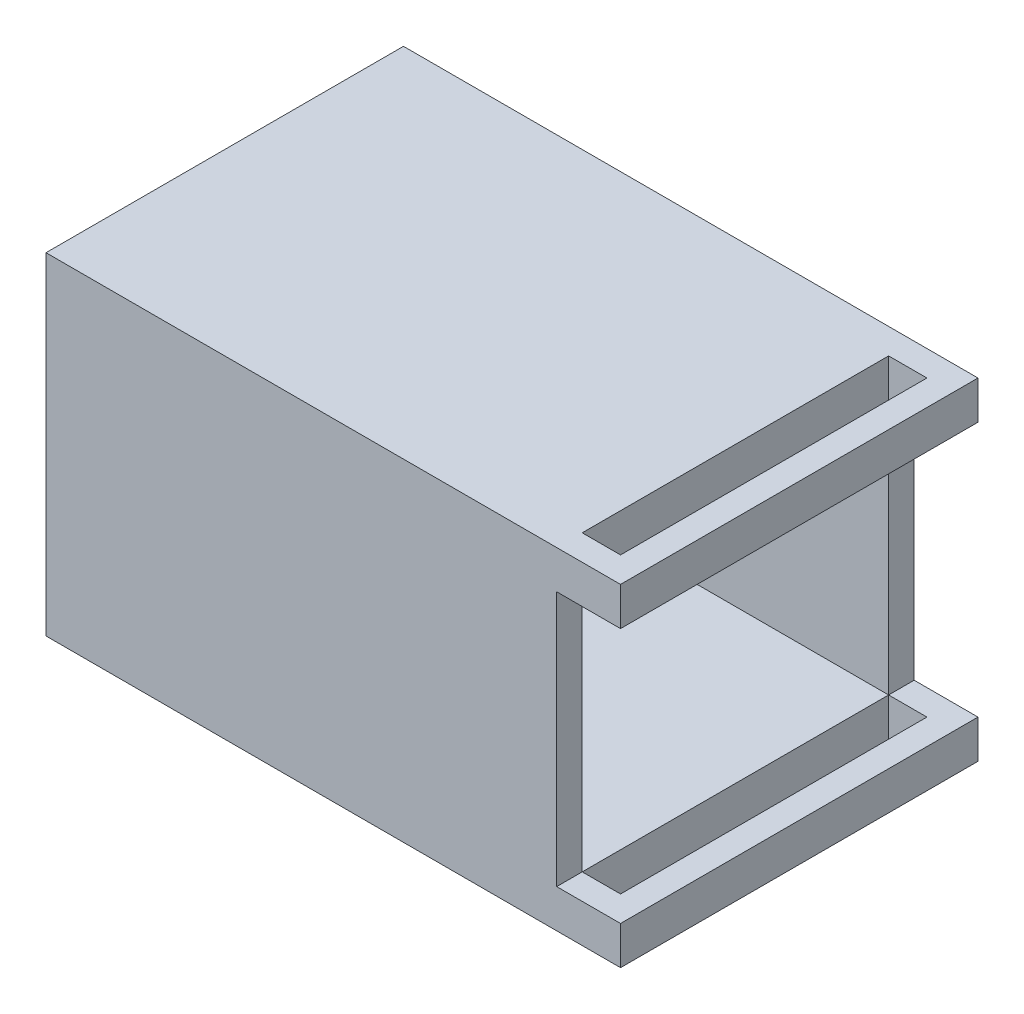
ISO-10303-21;
HEADER;
FILE_DESCRIPTION(('STEP AP214'),'2;1');
FILE_NAME('part.step','',(''),(''),'','','');
FILE_SCHEMA(('AUTOMOTIVE_DESIGN { 1 0 10303 214 1 1 1 1 }'));
ENDSEC;
DATA;
#1=APPLICATION_CONTEXT('core data for automotive mechanical design processes');
#2=APPLICATION_PROTOCOL_DEFINITION('international standard','automotive_design',2000,#1);
#3=PRODUCT_CONTEXT('',#1,'mechanical');
#4=PRODUCT('Part','Part','',(#3));
#5=PRODUCT_RELATED_PRODUCT_CATEGORY('part','',(#4));
#6=PRODUCT_DEFINITION_FORMATION('','',#4);
#7=PRODUCT_DEFINITION_CONTEXT('part definition',#1,'design');
#8=PRODUCT_DEFINITION('design','',#6,#7);
#9=PRODUCT_DEFINITION_SHAPE('','',#8);
#10=(LENGTH_UNIT() NAMED_UNIT(*) SI_UNIT(.MILLI.,.METRE.));
#11=(NAMED_UNIT(*) PLANE_ANGLE_UNIT() SI_UNIT($,.RADIAN.));
#12=(NAMED_UNIT(*) SI_UNIT($,.STERADIAN.) SOLID_ANGLE_UNIT());
#13=UNCERTAINTY_MEASURE_WITH_UNIT(LENGTH_MEASURE(1.E-05),#10,'distance_accuracy_value','');
#14=(GEOMETRIC_REPRESENTATION_CONTEXT(3) GLOBAL_UNCERTAINTY_ASSIGNED_CONTEXT((#13)) GLOBAL_UNIT_ASSIGNED_CONTEXT((#10,
#11,#12)) REPRESENTATION_CONTEXT('',''));
#15=CARTESIAN_POINT('',(0.,0.,0.));
#16=DIRECTION('',(0.,0.,1.));
#17=DIRECTION('',(1.,0.,0.));
#18=AXIS2_PLACEMENT_3D('',#15,#16,#17);
#19=CARTESIAN_POINT('',(0.,3.,0.));
#20=DIRECTION('',(0.,1.,0.));
#21=DIRECTION('',(0.,0.,1.));
#22=AXIS2_PLACEMENT_3D('',#19,#20,#21);
#23=PLANE('',#22);
#24=DIRECTION('',(0.,0.,-1.));
#25=VECTOR('',#24,1.);
#26=CARTESIAN_POINT('',(43.,3.,-2.));
#27=LINE('',#26,#25);
#28=CARTESIAN_POINT('',(43.,3.,-2.));
#29=VERTEX_POINT('',#28);
#30=CARTESIAN_POINT('',(43.,3.,-26.));
#31=VERTEX_POINT('',#30);
#32=EDGE_CURVE('E63',#29,#31,#27,.T.);
#33=ORIENTED_EDGE('',*,*,#32,.F.);
#34=DIRECTION('',(1.,0.,0.));
#35=VECTOR('',#34,1.);
#36=CARTESIAN_POINT('',(43.,3.,-2.));
#37=LINE('',#36,#35);
#38=CARTESIAN_POINT('',(40.,3.,-2.));
#39=VERTEX_POINT('',#38);
#40=EDGE_CURVE('E303',#39,#29,#37,.T.);
#41=ORIENTED_EDGE('',*,*,#40,.F.);
#42=DIRECTION('',(0.,0.,1.));
#43=VECTOR('',#42,1.);
#44=CARTESIAN_POINT('',(40.,3.,-2.));
#45=LINE('',#44,#43);
#46=CARTESIAN_POINT('',(40.,3.,0.));
#47=VERTEX_POINT('',#46);
#48=EDGE_CURVE('E528',#39,#47,#45,.T.);
#49=ORIENTED_EDGE('',*,*,#48,.T.);
#50=DIRECTION('',(1.,0.,0.));
#51=VECTOR('',#50,1.);
#52=CARTESIAN_POINT('',(0.,3.,0.));
#53=LINE('',#52,#51);
#54=CARTESIAN_POINT('',(45.,3.,0.));
#55=VERTEX_POINT('',#54);
#56=EDGE_CURVE('E569',#47,#55,#53,.T.);
#57=ORIENTED_EDGE('',*,*,#56,.T.);
#58=DIRECTION('',(0.,0.,-1.));
#59=VECTOR('',#58,1.);
#60=CARTESIAN_POINT('',(45.,3.,0.));
#61=LINE('',#60,#59);
#62=CARTESIAN_POINT('',(45.,3.,-28.));
#63=VERTEX_POINT('',#62);
#64=EDGE_CURVE('E564',#55,#63,#61,.T.);
#65=ORIENTED_EDGE('',*,*,#64,.T.);
#66=DIRECTION('',(1.,0.,0.));
#67=VECTOR('',#66,1.);
#68=CARTESIAN_POINT('',(0.,3.,-28.));
#69=LINE('',#68,#67);
#70=CARTESIAN_POINT('',(40.,3.,-28.));
#71=VERTEX_POINT('',#70);
#72=EDGE_CURVE('E561',#71,#63,#69,.T.);
#73=ORIENTED_EDGE('',*,*,#72,.F.);
#74=DIRECTION('',(0.,0.,-1.));
#75=VECTOR('',#74,1.);
#76=CARTESIAN_POINT('',(40.,3.,-26.));
#77=LINE('',#76,#75);
#78=CARTESIAN_POINT('',(40.,3.,-26.));
#79=VERTEX_POINT('',#78);
#80=EDGE_CURVE('E532',#79,#71,#77,.T.);
#81=ORIENTED_EDGE('',*,*,#80,.F.);
#82=DIRECTION('',(-1.,0.,0.));
#83=VECTOR('',#82,1.);
#84=CARTESIAN_POINT('',(43.,3.,-26.));
#85=LINE('',#84,#83);
#86=EDGE_CURVE('E316',#31,#79,#85,.T.);
#87=ORIENTED_EDGE('',*,*,#86,.F.);
#88=EDGE_LOOP('',(#33,#41,#49,#57,#65,#73,#81,#87));
#89=FACE_BOUND('',#88,.T.);
#90=ADVANCED_FACE('F47',(#89),#23,.T.);
#91=CARTESIAN_POINT('',(2.,25.,-26.));
#92=DIRECTION('',(1.,0.,0.));
#93=DIRECTION('',(0.,0.,-1.));
#94=AXIS2_PLACEMENT_3D('',#91,#92,#93);
#95=PLANE('',#94);
#96=CARTESIAN_POINT('',(2.,5.25,-17.47));
#97=DIRECTION('',(-1.,0.,0.));
#98=DIRECTION('',(0.,0.,1.));
#99=AXIS2_PLACEMENT_3D('',#96,#97,#98);
#100=CIRCLE('',#99,1.25);
#101=CARTESIAN_POINT('',(2.,5.25,-18.72));
#102=VERTEX_POINT('',#101);
#103=CARTESIAN_POINT('',(2.,4.,-17.47));
#104=VERTEX_POINT('',#103);
#105=EDGE_CURVE('E339',#102,#104,#100,.T.);
#106=ORIENTED_EDGE('',*,*,#105,.T.);
#107=DIRECTION('',(0.,0.,1.));
#108=VECTOR('',#107,1.);
#109=CARTESIAN_POINT('',(2.,4.,-17.47));
#110=LINE('',#109,#108);
#111=CARTESIAN_POINT('',(2.,4.,-10.53));
#112=VERTEX_POINT('',#111);
#113=EDGE_CURVE('E343',#104,#112,#110,.T.);
#114=ORIENTED_EDGE('',*,*,#113,.T.);
#115=CARTESIAN_POINT('',(2.,5.25,-10.53));
#116=DIRECTION('',(-1.,0.,0.));
#117=DIRECTION('',(0.,0.,1.));
#118=AXIS2_PLACEMENT_3D('',#115,#116,#117);
#119=CIRCLE('',#118,1.25);
#120=CARTESIAN_POINT('',(2.,5.25,-9.28));
#121=VERTEX_POINT('',#120);
#122=EDGE_CURVE('E348',#112,#121,#119,.T.);
#123=ORIENTED_EDGE('',*,*,#122,.T.);
#124=DIRECTION('',(0.,1.,0.));
#125=VECTOR('',#124,1.);
#126=CARTESIAN_POINT('',(2.,6.16,-9.28000000000001));
#127=LINE('',#126,#125);
#128=CARTESIAN_POINT('',(2.,6.16,-9.28));
#129=VERTEX_POINT('',#128);
#130=EDGE_CURVE('E352',#121,#129,#127,.T.);
#131=ORIENTED_EDGE('',*,*,#130,.T.);
#132=CARTESIAN_POINT('',(2.,6.16,-10.53));
#133=DIRECTION('',(-1.,0.,0.));
#134=DIRECTION('',(0.,0.,1.));
#135=AXIS2_PLACEMENT_3D('',#132,#133,#134);
#136=CIRCLE('',#135,1.25);
#137=CARTESIAN_POINT('',(2.,7.41,-10.53));
#138=VERTEX_POINT('',#137);
#139=EDGE_CURVE('E356',#129,#138,#136,.T.);
#140=ORIENTED_EDGE('',*,*,#139,.T.);
#141=DIRECTION('',(0.,0.,-1.));
#142=VECTOR('',#141,1.);
#143=CARTESIAN_POINT('',(2.,7.41,-17.47));
#144=LINE('',#143,#142);
#145=CARTESIAN_POINT('',(2.,7.41,-17.47));
#146=VERTEX_POINT('',#145);
#147=EDGE_CURVE('E360',#138,#146,#144,.T.);
#148=ORIENTED_EDGE('',*,*,#147,.T.);
#149=CARTESIAN_POINT('',(2.,6.16,-17.47));
#150=DIRECTION('',(-1.,0.,0.));
#151=DIRECTION('',(0.,0.,1.));
#152=AXIS2_PLACEMENT_3D('',#149,#150,#151);
#153=CIRCLE('',#152,1.25);
#154=CARTESIAN_POINT('',(2.,6.16,-18.72));
#155=VERTEX_POINT('',#154);
#156=EDGE_CURVE('E364',#146,#155,#153,.T.);
#157=ORIENTED_EDGE('',*,*,#156,.T.);
#158=DIRECTION('',(0.,-1.,0.));
#159=VECTOR('',#158,1.);
#160=CARTESIAN_POINT('',(2.,5.25,-18.72));
#161=LINE('',#160,#159);
#162=EDGE_CURVE('E368',#155,#102,#161,.T.);
#163=ORIENTED_EDGE('',*,*,#162,.T.);
#164=EDGE_LOOP('',(#106,#114,#123,#131,#140,#148,#157,#163));
#165=FACE_BOUND('',#164,.T.);
#166=DIRECTION('',(0.,-1.,0.));
#167=VECTOR('',#166,1.);
#168=CARTESIAN_POINT('',(2.,12.5,-18.5));
#169=LINE('',#168,#167);
#170=CARTESIAN_POINT('',(2.,12.5,-18.5));
#171=VERTEX_POINT('',#170);
#172=CARTESIAN_POINT('',(2.,8.5,-18.5));
#173=VERTEX_POINT('',#172);
#174=EDGE_CURVE('E447',#171,#173,#169,.T.);
#175=ORIENTED_EDGE('',*,*,#174,.T.);
#176=DIRECTION('',(0.,0.,1.));
#177=VECTOR('',#176,1.);
#178=CARTESIAN_POINT('',(2.,8.5,-18.5));
#179=LINE('',#178,#177);
#180=CARTESIAN_POINT('',(2.,8.5,-9.50000000000001));
#181=VERTEX_POINT('',#180);
#182=EDGE_CURVE('E464',#173,#181,#179,.T.);
#183=ORIENTED_EDGE('',*,*,#182,.T.);
#184=DIRECTION('',(0.,1.,0.));
#185=VECTOR('',#184,1.);
#186=CARTESIAN_POINT('',(2.,12.5,-9.5));
#187=LINE('',#186,#185);
#188=CARTESIAN_POINT('',(2.,12.5,-9.5));
#189=VERTEX_POINT('',#188);
#190=EDGE_CURVE('E460',#181,#189,#187,.T.);
#191=ORIENTED_EDGE('',*,*,#190,.T.);
#192=DIRECTION('',(0.,0.,-1.));
#193=VECTOR('',#192,1.);
#194=CARTESIAN_POINT('',(2.,12.5,-18.5));
#195=LINE('',#194,#193);
#196=EDGE_CURVE('E433',#189,#171,#195,.T.);
#197=ORIENTED_EDGE('',*,*,#196,.T.);
#198=EDGE_LOOP('',(#175,#183,#191,#197));
#199=FACE_BOUND('',#198,.T.);
#200=DIRECTION('',(0.,-1.,0.));
#201=VECTOR('',#200,1.);
#202=CARTESIAN_POINT('',(2.,25.,-26.));
#203=LINE('',#202,#201);
#204=CARTESIAN_POINT('',(2.,23.,-26.));
#205=VERTEX_POINT('',#204);
#206=CARTESIAN_POINT('',(2.,3.,-26.));
#207=VERTEX_POINT('',#206);
#208=EDGE_CURVE('E541',#205,#207,#203,.T.);
#209=ORIENTED_EDGE('',*,*,#208,.F.);
#210=DIRECTION('',(0.,0.,1.));
#211=VECTOR('',#210,1.);
#212=CARTESIAN_POINT('',(2.,23.,-26.));
#213=LINE('',#212,#211);
#214=CARTESIAN_POINT('',(2.,23.,-2.));
#215=VERTEX_POINT('',#214);
#216=EDGE_CURVE('E509',#205,#215,#213,.T.);
#217=ORIENTED_EDGE('',*,*,#216,.T.);
#218=DIRECTION('',(0.,-1.,0.));
#219=VECTOR('',#218,1.);
#220=CARTESIAN_POINT('',(2.,25.,-2.));
#221=LINE('',#220,#219);
#222=CARTESIAN_POINT('',(2.,3.,-2.));
#223=VERTEX_POINT('',#222);
#224=EDGE_CURVE('E540',#215,#223,#221,.T.);
#225=ORIENTED_EDGE('',*,*,#224,.T.);
#226=DIRECTION('',(0.,0.,1.));
#227=VECTOR('',#226,1.);
#228=CARTESIAN_POINT('',(2.,3.,-26.));
#229=LINE('',#228,#227);
#230=EDGE_CURVE('E520',#207,#223,#229,.T.);
#231=ORIENTED_EDGE('',*,*,#230,.F.);
#232=EDGE_LOOP('',(#209,#217,#225,#231));
#233=FACE_BOUND('',#232,.T.);
#234=ADVANCED_FACE('F662',(#165,#199,#233),#95,.T.);
#235=CARTESIAN_POINT('',(2.,25.,-26.));
#236=DIRECTION('',(0.,0.,-1.));
#237=DIRECTION('',(-1.,0.,0.));
#238=AXIS2_PLACEMENT_3D('',#235,#236,#237);
#239=PLANE('',#238);
#240=DIRECTION('',(1.,0.,0.));
#241=VECTOR('',#240,1.);
#242=CARTESIAN_POINT('',(2.,23.,-26.));
#243=LINE('',#242,#241);
#244=CARTESIAN_POINT('',(40.,23.,-26.));
#245=VERTEX_POINT('',#244);
#246=EDGE_CURVE('E512',#205,#245,#243,.T.);
#247=ORIENTED_EDGE('',*,*,#246,.F.);
#248=ORIENTED_EDGE('',*,*,#208,.T.);
#249=DIRECTION('',(1.,0.,0.));
#250=VECTOR('',#249,1.);
#251=CARTESIAN_POINT('',(2.,3.,-26.));
#252=LINE('',#251,#250);
#253=EDGE_CURVE('E536',#207,#79,#252,.T.);
#254=ORIENTED_EDGE('',*,*,#253,.T.);
#255=DIRECTION('',(0.,-1.,0.));
#256=VECTOR('',#255,1.);
#257=CARTESIAN_POINT('',(40.,25.,-26.));
#258=LINE('',#257,#256);
#259=EDGE_CURVE('E545',#245,#79,#258,.T.);
#260=ORIENTED_EDGE('',*,*,#259,.F.);
#261=EDGE_LOOP('',(#247,#248,#254,#260));
#262=FACE_BOUND('',#261,.T.);
#263=ADVANCED_FACE('F629',(#262),#239,.F.);
#264=CARTESIAN_POINT('',(40.,25.,-26.));
#265=DIRECTION('',(-1.,0.,0.));
#266=DIRECTION('',(0.,0.,1.));
#267=AXIS2_PLACEMENT_3D('',#264,#265,#266);
#268=PLANE('',#267);
#269=DIRECTION('',(0.,0.,-1.));
#270=VECTOR('',#269,1.);
#271=CARTESIAN_POINT('',(40.,23.,-26.));
#272=LINE('',#271,#270);
#273=CARTESIAN_POINT('',(40.,23.,-28.));
#274=VERTEX_POINT('',#273);
#275=EDGE_CURVE('E516',#245,#274,#272,.T.);
#276=ORIENTED_EDGE('',*,*,#275,.F.);
#277=ORIENTED_EDGE('',*,*,#259,.T.);
#278=ORIENTED_EDGE('',*,*,#80,.T.);
#279=DIRECTION('',(0.,-1.,0.));
#280=VECTOR('',#279,1.);
#281=CARTESIAN_POINT('',(40.,25.,-28.));
#282=LINE('',#281,#280);
#283=EDGE_CURVE('E549',#274,#71,#282,.T.);
#284=ORIENTED_EDGE('',*,*,#283,.F.);
#285=EDGE_LOOP('',(#276,#277,#278,#284));
#286=FACE_BOUND('',#285,.T.);
#287=ADVANCED_FACE('F626',(#286),#268,.F.);
#288=CARTESIAN_POINT('',(40.,25.,-2.));
#289=DIRECTION('',(1.,0.,0.));
#290=DIRECTION('',(0.,0.,-1.));
#291=AXIS2_PLACEMENT_3D('',#288,#289,#290);
#292=PLANE('',#291);
#293=DIRECTION('',(0.,-1.,0.));
#294=VECTOR('',#293,1.);
#295=CARTESIAN_POINT('',(40.,25.,-2.));
#296=LINE('',#295,#294);
#297=CARTESIAN_POINT('',(40.,23.,-2.));
#298=VERTEX_POINT('',#297);
#299=EDGE_CURVE('E555',#298,#39,#296,.T.);
#300=ORIENTED_EDGE('',*,*,#299,.F.);
#301=DIRECTION('',(0.,0.,1.));
#302=VECTOR('',#301,1.);
#303=CARTESIAN_POINT('',(40.,23.,-2.));
#304=LINE('',#303,#302);
#305=CARTESIAN_POINT('',(40.,23.,0.));
#306=VERTEX_POINT('',#305);
#307=EDGE_CURVE('E504',#298,#306,#304,.T.);
#308=ORIENTED_EDGE('',*,*,#307,.T.);
#309=DIRECTION('',(0.,-1.,0.));
#310=VECTOR('',#309,1.);
#311=CARTESIAN_POINT('',(40.,25.,0.));
#312=LINE('',#311,#310);
#313=EDGE_CURVE('E552',#306,#47,#312,.T.);
#314=ORIENTED_EDGE('',*,*,#313,.T.);
#315=ORIENTED_EDGE('',*,*,#48,.F.);
#316=EDGE_LOOP('',(#300,#308,#314,#315));
#317=FACE_BOUND('',#316,.T.);
#318=ADVANCED_FACE('F644',(#317),#292,.T.);
#319=CARTESIAN_POINT('',(2.,25.,-2.));
#320=DIRECTION('',(0.,0.,-1.));
#321=DIRECTION('',(-1.,0.,0.));
#322=AXIS2_PLACEMENT_3D('',#319,#320,#321);
#323=PLANE('',#322);
#324=ORIENTED_EDGE('',*,*,#224,.F.);
#325=DIRECTION('',(1.,0.,0.));
#326=VECTOR('',#325,1.);
#327=CARTESIAN_POINT('',(2.,23.,-2.));
#328=LINE('',#327,#326);
#329=EDGE_CURVE('E11',#215,#298,#328,.T.);
#330=ORIENTED_EDGE('',*,*,#329,.T.);
#331=ORIENTED_EDGE('',*,*,#299,.T.);
#332=DIRECTION('',(1.,0.,0.));
#333=VECTOR('',#332,1.);
#334=CARTESIAN_POINT('',(2.,3.,-2.));
#335=LINE('',#334,#333);
#336=EDGE_CURVE('E524',#223,#39,#335,.T.);
#337=ORIENTED_EDGE('',*,*,#336,.F.);
#338=EDGE_LOOP('',(#324,#330,#331,#337));
#339=FACE_BOUND('',#338,.T.);
#340=ADVANCED_FACE('F656',(#339),#323,.T.);
#341=DIRECTION('',(0.,0.,1.));
#342=VECTOR('',#341,1.);
#343=CARTESIAN_POINT('',(40.,3.,-2.));
#344=LINE('',#343,#342);
#345=EDGE_CURVE('E320',#79,#39,#344,.T.);
#346=ORIENTED_EDGE('',*,*,#345,.F.);
#347=ORIENTED_EDGE('',*,*,#253,.F.);
#348=ORIENTED_EDGE('',*,*,#230,.T.);
#349=ORIENTED_EDGE('',*,*,#336,.T.);
#350=EDGE_LOOP('',(#346,#347,#348,#349));
#351=FACE_BOUND('',#350,.T.);
#352=ADVANCED_FACE('F659',(#351),#23,.T.);
#353=CARTESIAN_POINT('',(0.,3.,-28.));
#354=DIRECTION('',(0.,0.,-1.));
#355=DIRECTION('',(-1.,0.,0.));
#356=AXIS2_PLACEMENT_3D('',#353,#354,#355);
#357=PLANE('',#356);
#358=DIRECTION('',(-1.,0.,0.));
#359=VECTOR('',#358,1.);
#360=CARTESIAN_POINT('',(0.,23.,-28.));
#361=LINE('',#360,#359);
#362=CARTESIAN_POINT('',(45.,23.,-28.));
#363=VERTEX_POINT('',#362);
#364=EDGE_CURVE('E496',#363,#274,#361,.T.);
#365=ORIENTED_EDGE('',*,*,#364,.T.);
#366=ORIENTED_EDGE('',*,*,#283,.T.);
#367=ORIENTED_EDGE('',*,*,#72,.T.);
#368=DIRECTION('',(0.,-1.,0.));
#369=VECTOR('',#368,1.);
#370=CARTESIAN_POINT('',(45.,3.,-28.));
#371=LINE('',#370,#369);
#372=CARTESIAN_POINT('',(45.,0.,-28.));
#373=VERTEX_POINT('',#372);
#374=EDGE_CURVE('E572',#63,#373,#371,.T.);
#375=ORIENTED_EDGE('',*,*,#374,.T.);
#376=DIRECTION('',(1.,0.,0.));
#377=VECTOR('',#376,1.);
#378=CARTESIAN_POINT('',(0.,0.,-28.));
#379=LINE('',#378,#377);
#380=CARTESIAN_POINT('',(0.,0.,-28.));
#381=VERTEX_POINT('',#380);
#382=EDGE_CURVE('E544',#381,#373,#379,.T.);
#383=ORIENTED_EDGE('',*,*,#382,.F.);
#384=DIRECTION('',(0.,-1.,0.));
#385=VECTOR('',#384,1.);
#386=CARTESIAN_POINT('',(0.,3.,-28.));
#387=LINE('',#386,#385);
#388=CARTESIAN_POINT('',(0.,26.,-28.));
#389=VERTEX_POINT('',#388);
#390=EDGE_CURVE('E56',#389,#381,#387,.T.);
#391=ORIENTED_EDGE('',*,*,#390,.F.);
#392=DIRECTION('',(-1.,0.,0.));
#393=VECTOR('',#392,1.);
#394=CARTESIAN_POINT('',(0.,26.,-28.));
#395=LINE('',#394,#393);
#396=CARTESIAN_POINT('',(45.,26.,-28.));
#397=VERTEX_POINT('',#396);
#398=EDGE_CURVE('E294',#397,#389,#395,.T.);
#399=ORIENTED_EDGE('',*,*,#398,.F.);
#400=DIRECTION('',(0.,1.,0.));
#401=VECTOR('',#400,1.);
#402=CARTESIAN_POINT('',(45.,23.,-28.));
#403=LINE('',#402,#401);
#404=EDGE_CURVE('E501',#363,#397,#403,.T.);
#405=ORIENTED_EDGE('',*,*,#404,.F.);
#406=EDGE_LOOP('',(#365,#366,#367,#375,#383,#391,#399,#405));
#407=FACE_BOUND('',#406,.T.);
#408=ADVANCED_FACE('F49',(#407),#357,.T.);
#409=CARTESIAN_POINT('',(0.,3.,0.));
#410=DIRECTION('',(-1.,0.,0.));
#411=DIRECTION('',(0.,0.,1.));
#412=AXIS2_PLACEMENT_3D('',#409,#410,#411);
#413=PLANE('',#412);
#414=CARTESIAN_POINT('',(0.,5.25,-17.47));
#415=DIRECTION('',(-1.,0.,0.));
#416=DIRECTION('',(0.,0.,1.));
#417=AXIS2_PLACEMENT_3D('',#414,#415,#416);
#418=CIRCLE('',#417,1.25);
#419=CARTESIAN_POINT('',(0.,5.25,-18.72));
#420=VERTEX_POINT('',#419);
#421=CARTESIAN_POINT('',(0.,4.,-17.47));
#422=VERTEX_POINT('',#421);
#423=EDGE_CURVE('E373',#420,#422,#418,.T.);
#424=ORIENTED_EDGE('',*,*,#423,.F.);
#425=DIRECTION('',(0.,-1.,0.));
#426=VECTOR('',#425,1.);
#427=CARTESIAN_POINT('',(0.,5.25,-18.72));
#428=LINE('',#427,#426);
#429=CARTESIAN_POINT('',(0.,6.16,-18.72));
#430=VERTEX_POINT('',#429);
#431=EDGE_CURVE('E344',#430,#420,#428,.T.);
#432=ORIENTED_EDGE('',*,*,#431,.F.);
#433=CARTESIAN_POINT('',(0.,6.16,-17.47));
#434=DIRECTION('',(-1.,0.,0.));
#435=DIRECTION('',(0.,0.,1.));
#436=AXIS2_PLACEMENT_3D('',#433,#434,#435);
#437=CIRCLE('',#436,1.25);
#438=CARTESIAN_POINT('',(0.,7.41,-17.47));
#439=VERTEX_POINT('',#438);
#440=EDGE_CURVE('E397',#439,#430,#437,.T.);
#441=ORIENTED_EDGE('',*,*,#440,.F.);
#442=DIRECTION('',(0.,0.,-1.));
#443=VECTOR('',#442,1.);
#444=CARTESIAN_POINT('',(0.,7.41,-17.47));
#445=LINE('',#444,#443);
#446=CARTESIAN_POINT('',(0.,7.41,-10.53));
#447=VERTEX_POINT('',#446);
#448=EDGE_CURVE('E393',#447,#439,#445,.T.);
#449=ORIENTED_EDGE('',*,*,#448,.F.);
#450=CARTESIAN_POINT('',(0.,6.16,-10.53));
#451=DIRECTION('',(-1.,0.,0.));
#452=DIRECTION('',(0.,0.,1.));
#453=AXIS2_PLACEMENT_3D('',#450,#451,#452);
#454=CIRCLE('',#453,1.25);
#455=CARTESIAN_POINT('',(0.,6.16,-9.28));
#456=VERTEX_POINT('',#455);
#457=EDGE_CURVE('E389',#456,#447,#454,.T.);
#458=ORIENTED_EDGE('',*,*,#457,.F.);
#459=DIRECTION('',(0.,1.,0.));
#460=VECTOR('',#459,1.);
#461=CARTESIAN_POINT('',(0.,6.16,-9.28000000000001));
#462=LINE('',#461,#460);
#463=CARTESIAN_POINT('',(0.,5.25,-9.28));
#464=VERTEX_POINT('',#463);
#465=EDGE_CURVE('E385',#464,#456,#462,.T.);
#466=ORIENTED_EDGE('',*,*,#465,.F.);
#467=CARTESIAN_POINT('',(0.,5.25,-10.53));
#468=DIRECTION('',(-1.,0.,0.));
#469=DIRECTION('',(0.,0.,1.));
#470=AXIS2_PLACEMENT_3D('',#467,#468,#469);
#471=CIRCLE('',#470,1.25);
#472=CARTESIAN_POINT('',(0.,4.,-10.53));
#473=VERTEX_POINT('',#472);
#474=EDGE_CURVE('E381',#473,#464,#471,.T.);
#475=ORIENTED_EDGE('',*,*,#474,.F.);
#476=DIRECTION('',(0.,0.,1.));
#477=VECTOR('',#476,1.);
#478=CARTESIAN_POINT('',(0.,4.,-17.47));
#479=LINE('',#478,#477);
#480=EDGE_CURVE('E376',#422,#473,#479,.T.);
#481=ORIENTED_EDGE('',*,*,#480,.F.);
#482=EDGE_LOOP('',(#424,#432,#441,#449,#458,#466,#475,#481));
#483=FACE_BOUND('',#482,.T.);
#484=DIRECTION('',(0.,-1.,0.));
#485=VECTOR('',#484,1.);
#486=CARTESIAN_POINT('',(0.,12.5,-18.5));
#487=LINE('',#486,#485);
#488=CARTESIAN_POINT('',(0.,12.5,-18.5));
#489=VERTEX_POINT('',#488);
#490=CARTESIAN_POINT('',(0.,8.5,-18.5));
#491=VERTEX_POINT('',#490);
#492=EDGE_CURVE('E377',#489,#491,#487,.T.);
#493=ORIENTED_EDGE('',*,*,#492,.F.);
#494=DIRECTION('',(0.,0.,-1.));
#495=VECTOR('',#494,1.);
#496=CARTESIAN_POINT('',(0.,12.5,-18.5));
#497=LINE('',#496,#495);
#498=CARTESIAN_POINT('',(0.,12.5,-9.5));
#499=VERTEX_POINT('',#498);
#500=EDGE_CURVE('E442',#499,#489,#497,.T.);
#501=ORIENTED_EDGE('',*,*,#500,.F.);
#502=DIRECTION('',(0.,1.,0.));
#503=VECTOR('',#502,1.);
#504=CARTESIAN_POINT('',(0.,12.5,-9.5));
#505=LINE('',#504,#503);
#506=CARTESIAN_POINT('',(0.,8.5,-9.5));
#507=VERTEX_POINT('',#506);
#508=EDGE_CURVE('E446',#507,#499,#505,.T.);
#509=ORIENTED_EDGE('',*,*,#508,.F.);
#510=DIRECTION('',(0.,0.,1.));
#511=VECTOR('',#510,1.);
#512=CARTESIAN_POINT('',(0.,8.5,-18.5));
#513=LINE('',#512,#511);
#514=EDGE_CURVE('E451',#491,#507,#513,.T.);
#515=ORIENTED_EDGE('',*,*,#514,.F.);
#516=EDGE_LOOP('',(#493,#501,#509,#515));
#517=FACE_BOUND('',#516,.T.);
#518=ORIENTED_EDGE('',*,*,#390,.T.);
#519=DIRECTION('',(0.,0.,-1.));
#520=VECTOR('',#519,1.);
#521=CARTESIAN_POINT('',(0.,0.,0.));
#522=LINE('',#521,#520);
#523=CARTESIAN_POINT('',(0.,0.,0.));
#524=VERTEX_POINT('',#523);
#525=EDGE_CURVE('E565',#524,#381,#522,.T.);
#526=ORIENTED_EDGE('',*,*,#525,.F.);
#527=DIRECTION('',(0.,-1.,0.));
#528=VECTOR('',#527,1.);
#529=CARTESIAN_POINT('',(0.,3.,0.));
#530=LINE('',#529,#528);
#531=CARTESIAN_POINT('',(0.,26.,0.));
#532=VERTEX_POINT('',#531);
#533=EDGE_CURVE('E588',#532,#524,#530,.T.);
#534=ORIENTED_EDGE('',*,*,#533,.F.);
#535=DIRECTION('',(0.,0.,1.));
#536=VECTOR('',#535,1.);
#537=CARTESIAN_POINT('',(0.,26.,0.));
#538=LINE('',#537,#536);
#539=EDGE_CURVE('E282',#389,#532,#538,.T.);
#540=ORIENTED_EDGE('',*,*,#539,.F.);
#541=EDGE_LOOP('',(#518,#526,#534,#540));
#542=FACE_BOUND('',#541,.T.);
#543=ADVANCED_FACE('F609',(#483,#517,#542),#413,.T.);
#544=CARTESIAN_POINT('',(0.,3.,0.));
#545=DIRECTION('',(0.,0.,-1.));
#546=DIRECTION('',(-1.,0.,0.));
#547=AXIS2_PLACEMENT_3D('',#544,#545,#546);
#548=PLANE('',#547);
#549=ORIENTED_EDGE('',*,*,#533,.T.);
#550=DIRECTION('',(1.,0.,0.));
#551=VECTOR('',#550,1.);
#552=CARTESIAN_POINT('',(0.,0.,0.));
#553=LINE('',#552,#551);
#554=CARTESIAN_POINT('',(45.,0.,0.));
#555=VERTEX_POINT('',#554);
#556=EDGE_CURVE('E580',#524,#555,#553,.T.);
#557=ORIENTED_EDGE('',*,*,#556,.T.);
#558=DIRECTION('',(0.,-1.,0.));
#559=VECTOR('',#558,1.);
#560=CARTESIAN_POINT('',(45.,3.,0.));
#561=LINE('',#560,#559);
#562=EDGE_CURVE('E591',#55,#555,#561,.T.);
#563=ORIENTED_EDGE('',*,*,#562,.F.);
#564=ORIENTED_EDGE('',*,*,#56,.F.);
#565=ORIENTED_EDGE('',*,*,#313,.F.);
#566=DIRECTION('',(1.,0.,0.));
#567=VECTOR('',#566,1.);
#568=CARTESIAN_POINT('',(0.,23.,0.));
#569=LINE('',#568,#567);
#570=CARTESIAN_POINT('',(45.,23.,0.));
#571=VERTEX_POINT('',#570);
#572=EDGE_CURVE('E484',#306,#571,#569,.T.);
#573=ORIENTED_EDGE('',*,*,#572,.T.);
#574=DIRECTION('',(0.,1.,0.));
#575=VECTOR('',#574,1.);
#576=CARTESIAN_POINT('',(45.,23.,0.));
#577=LINE('',#576,#575);
#578=CARTESIAN_POINT('',(45.,26.,0.));
#579=VERTEX_POINT('',#578);
#580=EDGE_CURVE('E500',#571,#579,#577,.T.);
#581=ORIENTED_EDGE('',*,*,#580,.T.);
#582=DIRECTION('',(1.,0.,0.));
#583=VECTOR('',#582,1.);
#584=CARTESIAN_POINT('',(0.,26.,0.));
#585=LINE('',#584,#583);
#586=EDGE_CURVE('E286',#532,#579,#585,.T.);
#587=ORIENTED_EDGE('',*,*,#586,.F.);
#588=EDGE_LOOP('',(#549,#557,#563,#564,#565,#573,#581,#587));
#589=FACE_BOUND('',#588,.T.);
#590=ADVANCED_FACE('F648',(#589),#548,.F.);
#591=CARTESIAN_POINT('',(45.,3.,0.));
#592=DIRECTION('',(-1.,0.,0.));
#593=DIRECTION('',(0.,0.,1.));
#594=AXIS2_PLACEMENT_3D('',#591,#592,#593);
#595=PLANE('',#594);
#596=DIRECTION('',(0.,0.,-1.));
#597=VECTOR('',#596,1.);
#598=CARTESIAN_POINT('',(45.,0.,0.));
#599=LINE('',#598,#597);
#600=EDGE_CURVE('E576',#555,#373,#599,.T.);
#601=ORIENTED_EDGE('',*,*,#600,.T.);
#602=ORIENTED_EDGE('',*,*,#374,.F.);
#603=ORIENTED_EDGE('',*,*,#64,.F.);
#604=ORIENTED_EDGE('',*,*,#562,.T.);
#605=EDGE_LOOP('',(#601,#602,#603,#604));
#606=FACE_BOUND('',#605,.T.);
#607=ADVANCED_FACE('F602',(#606),#595,.F.);
#608=CARTESIAN_POINT('',(0.,0.,0.));
#609=DIRECTION('',(0.,1.,0.));
#610=DIRECTION('',(0.,0.,1.));
#611=AXIS2_PLACEMENT_3D('',#608,#609,#610);
#612=PLANE('',#611);
#613=DIRECTION('',(1.,0.,0.));
#614=VECTOR('',#613,1.);
#615=CARTESIAN_POINT('',(43.,0.,-2.));
#616=LINE('',#615,#614);
#617=CARTESIAN_POINT('',(40.,0.,-2.));
#618=VERTEX_POINT('',#617);
#619=CARTESIAN_POINT('',(43.,0.,-2.));
#620=VERTEX_POINT('',#619);
#621=EDGE_CURVE('E309',#618,#620,#616,.T.);
#622=ORIENTED_EDGE('',*,*,#621,.T.);
#623=DIRECTION('',(0.,0.,-1.));
#624=VECTOR('',#623,1.);
#625=CARTESIAN_POINT('',(43.,0.,-2.));
#626=LINE('',#625,#624);
#627=CARTESIAN_POINT('',(43.,0.,-26.));
#628=VERTEX_POINT('',#627);
#629=EDGE_CURVE('E298',#620,#628,#626,.T.);
#630=ORIENTED_EDGE('',*,*,#629,.T.);
#631=DIRECTION('',(-1.,0.,0.));
#632=VECTOR('',#631,1.);
#633=CARTESIAN_POINT('',(43.,0.,-26.));
#634=LINE('',#633,#632);
#635=CARTESIAN_POINT('',(40.,0.,-26.));
#636=VERTEX_POINT('',#635);
#637=EDGE_CURVE('E302',#628,#636,#634,.T.);
#638=ORIENTED_EDGE('',*,*,#637,.T.);
#639=DIRECTION('',(0.,0.,1.));
#640=VECTOR('',#639,1.);
#641=CARTESIAN_POINT('',(40.,0.,-2.));
#642=LINE('',#641,#640);
#643=EDGE_CURVE('E71',#636,#618,#642,.T.);
#644=ORIENTED_EDGE('',*,*,#643,.T.);
#645=EDGE_LOOP('',(#622,#630,#638,#644));
#646=FACE_BOUND('',#645,.T.);
#647=ORIENTED_EDGE('',*,*,#382,.T.);
#648=ORIENTED_EDGE('',*,*,#600,.F.);
#649=ORIENTED_EDGE('',*,*,#556,.F.);
#650=ORIENTED_EDGE('',*,*,#525,.T.);
#651=EDGE_LOOP('',(#647,#648,#649,#650));
#652=FACE_BOUND('',#651,.T.);
#653=ADVANCED_FACE('F606',(#646,#652),#612,.F.);
#654=CARTESIAN_POINT('',(0.,23.,0.));
#655=DIRECTION('',(0.,1.,0.));
#656=DIRECTION('',(0.,0.,1.));
#657=AXIS2_PLACEMENT_3D('',#654,#655,#656);
#658=PLANE('',#657);
#659=DIRECTION('',(-1.,0.,0.));
#660=VECTOR('',#659,1.);
#661=CARTESIAN_POINT('',(40.,23.,-26.));
#662=LINE('',#661,#660);
#663=CARTESIAN_POINT('',(43.,23.,-26.));
#664=VERTEX_POINT('',#663);
#665=EDGE_CURVE('E259',#664,#245,#662,.T.);
#666=ORIENTED_EDGE('',*,*,#665,.T.);
#667=ORIENTED_EDGE('',*,*,#275,.T.);
#668=ORIENTED_EDGE('',*,*,#364,.F.);
#669=DIRECTION('',(0.,0.,-1.));
#670=VECTOR('',#669,1.);
#671=CARTESIAN_POINT('',(45.,23.,-28.));
#672=LINE('',#671,#670);
#673=EDGE_CURVE('E492',#571,#363,#672,.T.);
#674=ORIENTED_EDGE('',*,*,#673,.F.);
#675=ORIENTED_EDGE('',*,*,#572,.F.);
#676=ORIENTED_EDGE('',*,*,#307,.F.);
#677=DIRECTION('',(1.,0.,0.));
#678=VECTOR('',#677,1.);
#679=CARTESIAN_POINT('',(40.,23.,-2.));
#680=LINE('',#679,#678);
#681=CARTESIAN_POINT('',(43.,23.,-2.));
#682=VERTEX_POINT('',#681);
#683=EDGE_CURVE('E253',#298,#682,#680,.T.);
#684=ORIENTED_EDGE('',*,*,#683,.T.);
#685=DIRECTION('',(0.,0.,-1.));
#686=VECTOR('',#685,1.);
#687=CARTESIAN_POINT('',(43.,23.,-26.));
#688=LINE('',#687,#686);
#689=EDGE_CURVE('E475',#682,#664,#688,.T.);
#690=ORIENTED_EDGE('',*,*,#689,.T.);
#691=EDGE_LOOP('',(#666,#667,#668,#674,#675,#676,#684,#690));
#692=FACE_BOUND('',#691,.T.);
#693=ADVANCED_FACE('F621',(#692),#658,.F.);
#694=ORIENTED_EDGE('',*,*,#216,.F.);
#695=ORIENTED_EDGE('',*,*,#246,.T.);
#696=DIRECTION('',(0.,0.,1.));
#697=VECTOR('',#696,1.);
#698=CARTESIAN_POINT('',(40.,23.,-26.));
#699=LINE('',#698,#697);
#700=EDGE_CURVE('E407',#245,#298,#699,.T.);
#701=ORIENTED_EDGE('',*,*,#700,.T.);
#702=ORIENTED_EDGE('',*,*,#329,.F.);
#703=EDGE_LOOP('',(#694,#695,#701,#702));
#704=FACE_BOUND('',#703,.T.);
#705=ADVANCED_FACE('F634',(#704),#658,.F.);
#706=CARTESIAN_POINT('',(45.,23.,-28.));
#707=DIRECTION('',(1.,0.,0.));
#708=DIRECTION('',(0.,0.,-1.));
#709=AXIS2_PLACEMENT_3D('',#706,#707,#708);
#710=PLANE('',#709);
#711=ORIENTED_EDGE('',*,*,#404,.T.);
#712=DIRECTION('',(0.,0.,-1.));
#713=VECTOR('',#712,1.);
#714=CARTESIAN_POINT('',(45.,26.,0.));
#715=LINE('',#714,#713);
#716=EDGE_CURVE('E290',#579,#397,#715,.T.);
#717=ORIENTED_EDGE('',*,*,#716,.F.);
#718=ORIENTED_EDGE('',*,*,#580,.F.);
#719=ORIENTED_EDGE('',*,*,#673,.T.);
#720=EDGE_LOOP('',(#711,#717,#718,#719));
#721=FACE_BOUND('',#720,.T.);
#722=ADVANCED_FACE('F617',(#721),#710,.T.);
#723=CARTESIAN_POINT('',(40.,23.,-26.));
#724=DIRECTION('',(-1.,0.,0.));
#725=DIRECTION('',(0.,0.,1.));
#726=AXIS2_PLACEMENT_3D('',#723,#724,#725);
#727=PLANE('',#726);
#728=DIRECTION('',(0.,1.,0.));
#729=VECTOR('',#728,1.);
#730=CARTESIAN_POINT('',(40.,23.,-26.));
#731=LINE('',#730,#729);
#732=CARTESIAN_POINT('',(40.,26.,-26.));
#733=VERTEX_POINT('',#732);
#734=EDGE_CURVE('E265',#245,#733,#731,.T.);
#735=ORIENTED_EDGE('',*,*,#734,.T.);
#736=DIRECTION('',(0.,0.,1.));
#737=VECTOR('',#736,1.);
#738=CARTESIAN_POINT('',(40.,26.,-26.));
#739=LINE('',#738,#737);
#740=CARTESIAN_POINT('',(40.,26.,-2.));
#741=VERTEX_POINT('',#740);
#742=EDGE_CURVE('E262',#733,#741,#739,.T.);
#743=ORIENTED_EDGE('',*,*,#742,.T.);
#744=DIRECTION('',(0.,1.,0.));
#745=VECTOR('',#744,1.);
#746=CARTESIAN_POINT('',(40.,23.,-2.));
#747=LINE('',#746,#745);
#748=EDGE_CURVE('E245',#298,#741,#747,.T.);
#749=ORIENTED_EDGE('',*,*,#748,.F.);
#750=ORIENTED_EDGE('',*,*,#700,.F.);
#751=EDGE_LOOP('',(#735,#743,#749,#750));
#752=FACE_BOUND('',#751,.T.);
#753=ADVANCED_FACE('F263',(#752),#727,.F.);
#754=CARTESIAN_POINT('',(40.,23.,-26.));
#755=DIRECTION('',(0.,0.,-1.));
#756=DIRECTION('',(-1.,0.,0.));
#757=AXIS2_PLACEMENT_3D('',#754,#755,#756);
#758=PLANE('',#757);
#759=DIRECTION('',(0.,1.,0.));
#760=VECTOR('',#759,1.);
#761=CARTESIAN_POINT('',(43.,23.,-26.));
#762=LINE('',#761,#760);
#763=CARTESIAN_POINT('',(43.,26.,-26.));
#764=VERTEX_POINT('',#763);
#765=EDGE_CURVE('E485',#664,#764,#762,.T.);
#766=ORIENTED_EDGE('',*,*,#765,.T.);
#767=DIRECTION('',(-1.,0.,0.));
#768=VECTOR('',#767,1.);
#769=CARTESIAN_POINT('',(40.,26.,-26.));
#770=LINE('',#769,#768);
#771=EDGE_CURVE('E277',#764,#733,#770,.T.);
#772=ORIENTED_EDGE('',*,*,#771,.T.);
#773=ORIENTED_EDGE('',*,*,#734,.F.);
#774=ORIENTED_EDGE('',*,*,#665,.F.);
#775=EDGE_LOOP('',(#766,#772,#773,#774));
#776=FACE_BOUND('',#775,.T.);
#777=ADVANCED_FACE('F637',(#776),#758,.F.);
#778=CARTESIAN_POINT('',(43.,23.,-26.));
#779=DIRECTION('',(1.,0.,0.));
#780=DIRECTION('',(0.,0.,-1.));
#781=AXIS2_PLACEMENT_3D('',#778,#779,#780);
#782=PLANE('',#781);
#783=DIRECTION('',(0.,1.,0.));
#784=VECTOR('',#783,1.);
#785=CARTESIAN_POINT('',(43.,23.,-2.));
#786=LINE('',#785,#784);
#787=CARTESIAN_POINT('',(43.,26.,-2.));
#788=VERTEX_POINT('',#787);
#789=EDGE_CURVE('E258',#682,#788,#786,.T.);
#790=ORIENTED_EDGE('',*,*,#789,.T.);
#791=DIRECTION('',(0.,0.,-1.));
#792=VECTOR('',#791,1.);
#793=CARTESIAN_POINT('',(43.,26.,-26.));
#794=LINE('',#793,#792);
#795=EDGE_CURVE('E273',#788,#764,#794,.T.);
#796=ORIENTED_EDGE('',*,*,#795,.T.);
#797=ORIENTED_EDGE('',*,*,#765,.F.);
#798=ORIENTED_EDGE('',*,*,#689,.F.);
#799=EDGE_LOOP('',(#790,#796,#797,#798));
#800=FACE_BOUND('',#799,.T.);
#801=ADVANCED_FACE('F639',(#800),#782,.F.);
#802=CARTESIAN_POINT('',(40.,23.,-2.));
#803=DIRECTION('',(0.,0.,1.));
#804=DIRECTION('',(1.,0.,0.));
#805=AXIS2_PLACEMENT_3D('',#802,#803,#804);
#806=PLANE('',#805);
#807=ORIENTED_EDGE('',*,*,#748,.T.);
#808=DIRECTION('',(1.,0.,0.));
#809=VECTOR('',#808,1.);
#810=CARTESIAN_POINT('',(40.,26.,-2.));
#811=LINE('',#810,#809);
#812=EDGE_CURVE('E250',#741,#788,#811,.T.);
#813=ORIENTED_EDGE('',*,*,#812,.T.);
#814=ORIENTED_EDGE('',*,*,#789,.F.);
#815=ORIENTED_EDGE('',*,*,#683,.F.);
#816=EDGE_LOOP('',(#807,#813,#814,#815));
#817=FACE_BOUND('',#816,.T.);
#818=ADVANCED_FACE('F247',(#817),#806,.F.);
#819=CARTESIAN_POINT('',(2.,12.5,-18.5));
#820=DIRECTION('',(0.,0.,-1.));
#821=DIRECTION('',(-1.,0.,0.));
#822=AXIS2_PLACEMENT_3D('',#819,#820,#821);
#823=PLANE('',#822);
#824=ORIENTED_EDGE('',*,*,#492,.T.);
#825=DIRECTION('',(-1.,0.,0.));
#826=VECTOR('',#825,1.);
#827=CARTESIAN_POINT('',(2.,8.5,-18.5));
#828=LINE('',#827,#826);
#829=EDGE_CURVE('E429',#173,#491,#828,.T.);
#830=ORIENTED_EDGE('',*,*,#829,.F.);
#831=ORIENTED_EDGE('',*,*,#174,.F.);
#832=DIRECTION('',(-1.,0.,0.));
#833=VECTOR('',#832,1.);
#834=CARTESIAN_POINT('',(2.,12.5,-18.5));
#835=LINE('',#834,#833);
#836=EDGE_CURVE('E330',#171,#489,#835,.T.);
#837=ORIENTED_EDGE('',*,*,#836,.T.);
#838=EDGE_LOOP('',(#824,#830,#831,#837));
#839=FACE_BOUND('',#838,.T.);
#840=ADVANCED_FACE('F756',(#839),#823,.F.);
#841=CARTESIAN_POINT('',(2.,12.5,-18.5));
#842=DIRECTION('',(0.,1.,0.));
#843=DIRECTION('',(0.,0.,1.));
#844=AXIS2_PLACEMENT_3D('',#841,#842,#843);
#845=PLANE('',#844);
#846=ORIENTED_EDGE('',*,*,#500,.T.);
#847=ORIENTED_EDGE('',*,*,#836,.F.);
#848=ORIENTED_EDGE('',*,*,#196,.F.);
#849=DIRECTION('',(-1.,0.,0.));
#850=VECTOR('',#849,1.);
#851=CARTESIAN_POINT('',(2.,12.5,-9.5));
#852=LINE('',#851,#850);
#853=EDGE_CURVE('E437',#189,#499,#852,.T.);
#854=ORIENTED_EDGE('',*,*,#853,.T.);
#855=EDGE_LOOP('',(#846,#847,#848,#854));
#856=FACE_BOUND('',#855,.T.);
#857=ADVANCED_FACE('F766',(#856),#845,.F.);
#858=CARTESIAN_POINT('',(2.,12.5,-9.5));
#859=DIRECTION('',(0.,0.,1.));
#860=DIRECTION('',(1.,0.,0.));
#861=AXIS2_PLACEMENT_3D('',#858,#859,#860);
#862=PLANE('',#861);
#863=ORIENTED_EDGE('',*,*,#508,.T.);
#864=ORIENTED_EDGE('',*,*,#853,.F.);
#865=ORIENTED_EDGE('',*,*,#190,.F.);
#866=DIRECTION('',(-1.,0.,0.));
#867=VECTOR('',#866,1.);
#868=CARTESIAN_POINT('',(2.,8.5,-9.5));
#869=LINE('',#868,#867);
#870=EDGE_CURVE('E434',#181,#507,#869,.T.);
#871=ORIENTED_EDGE('',*,*,#870,.T.);
#872=EDGE_LOOP('',(#863,#864,#865,#871));
#873=FACE_BOUND('',#872,.T.);
#874=ADVANCED_FACE('F776',(#873),#862,.F.);
#875=CARTESIAN_POINT('',(2.,8.5,-18.5));
#876=DIRECTION('',(0.,-1.,0.));
#877=DIRECTION('',(0.,0.,-1.));
#878=AXIS2_PLACEMENT_3D('',#875,#876,#877);
#879=PLANE('',#878);
#880=ORIENTED_EDGE('',*,*,#514,.T.);
#881=ORIENTED_EDGE('',*,*,#870,.F.);
#882=ORIENTED_EDGE('',*,*,#182,.F.);
#883=ORIENTED_EDGE('',*,*,#829,.T.);
#884=EDGE_LOOP('',(#880,#881,#882,#883));
#885=FACE_BOUND('',#884,.T.);
#886=ADVANCED_FACE('F786',(#885),#879,.F.);
#887=CARTESIAN_POINT('',(2.,5.25,-17.47));
#888=DIRECTION('',(-1.,0.,0.));
#889=DIRECTION('',(0.,0.,1.));
#890=AXIS2_PLACEMENT_3D('',#887,#888,#889);
#891=CYLINDRICAL_SURFACE('',#890,1.25);
#892=ORIENTED_EDGE('',*,*,#423,.T.);
#893=DIRECTION('',(-1.,0.,0.));
#894=VECTOR('',#893,1.);
#895=CARTESIAN_POINT('',(2.,4.,-17.47));
#896=LINE('',#895,#894);
#897=EDGE_CURVE('E372',#104,#422,#896,.T.);
#898=ORIENTED_EDGE('',*,*,#897,.F.);
#899=ORIENTED_EDGE('',*,*,#105,.F.);
#900=DIRECTION('',(-1.,0.,0.));
#901=VECTOR('',#900,1.);
#902=CARTESIAN_POINT('',(2.,5.25,-18.72));
#903=LINE('',#902,#901);
#904=EDGE_CURVE('E404',#102,#420,#903,.T.);
#905=ORIENTED_EDGE('',*,*,#904,.T.);
#906=EDGE_LOOP('',(#892,#898,#899,#905));
#907=FACE_BOUND('',#906,.T.);
#908=ADVANCED_FACE('F796',(#907),#891,.F.);
#909=CARTESIAN_POINT('',(2.,5.25,-18.72));
#910=DIRECTION('',(0.,0.,-1.));
#911=DIRECTION('',(-1.,0.,0.));
#912=AXIS2_PLACEMENT_3D('',#909,#910,#911);
#913=PLANE('',#912);
#914=ORIENTED_EDGE('',*,*,#431,.T.);
#915=ORIENTED_EDGE('',*,*,#904,.F.);
#916=ORIENTED_EDGE('',*,*,#162,.F.);
#917=DIRECTION('',(-1.,0.,0.));
#918=VECTOR('',#917,1.);
#919=CARTESIAN_POINT('',(2.,6.16,-18.72));
#920=LINE('',#919,#918);
#921=EDGE_CURVE('E408',#155,#430,#920,.T.);
#922=ORIENTED_EDGE('',*,*,#921,.T.);
#923=EDGE_LOOP('',(#914,#915,#916,#922));
#924=FACE_BOUND('',#923,.T.);
#925=ADVANCED_FACE('F806',(#924),#913,.F.);
#926=CARTESIAN_POINT('',(2.,6.16,-17.47));
#927=DIRECTION('',(-1.,0.,0.));
#928=DIRECTION('',(0.,0.,1.));
#929=AXIS2_PLACEMENT_3D('',#926,#927,#928);
#930=CYLINDRICAL_SURFACE('',#929,1.25);
#931=ORIENTED_EDGE('',*,*,#440,.T.);
#932=ORIENTED_EDGE('',*,*,#921,.F.);
#933=ORIENTED_EDGE('',*,*,#156,.F.);
#934=DIRECTION('',(-1.,0.,0.));
#935=VECTOR('',#934,1.);
#936=CARTESIAN_POINT('',(2.,7.41,-17.47));
#937=LINE('',#936,#935);
#938=EDGE_CURVE('E411',#146,#439,#937,.T.);
#939=ORIENTED_EDGE('',*,*,#938,.T.);
#940=EDGE_LOOP('',(#931,#932,#933,#939));
#941=FACE_BOUND('',#940,.T.);
#942=ADVANCED_FACE('F816',(#941),#930,.F.);
#943=CARTESIAN_POINT('',(2.,7.41,-17.47));
#944=DIRECTION('',(0.,1.,0.));
#945=DIRECTION('',(0.,0.,1.));
#946=AXIS2_PLACEMENT_3D('',#943,#944,#945);
#947=PLANE('',#946);
#948=ORIENTED_EDGE('',*,*,#448,.T.);
#949=ORIENTED_EDGE('',*,*,#938,.F.);
#950=ORIENTED_EDGE('',*,*,#147,.F.);
#951=DIRECTION('',(-1.,0.,0.));
#952=VECTOR('',#951,1.);
#953=CARTESIAN_POINT('',(2.,7.41,-10.53));
#954=LINE('',#953,#952);
#955=EDGE_CURVE('E414',#138,#447,#954,.T.);
#956=ORIENTED_EDGE('',*,*,#955,.T.);
#957=EDGE_LOOP('',(#948,#949,#950,#956));
#958=FACE_BOUND('',#957,.T.);
#959=ADVANCED_FACE('F826',(#958),#947,.F.);
#960=CARTESIAN_POINT('',(2.,6.16,-10.53));
#961=DIRECTION('',(-1.,0.,0.));
#962=DIRECTION('',(0.,0.,1.));
#963=AXIS2_PLACEMENT_3D('',#960,#961,#962);
#964=CYLINDRICAL_SURFACE('',#963,1.25);
#965=ORIENTED_EDGE('',*,*,#457,.T.);
#966=ORIENTED_EDGE('',*,*,#955,.F.);
#967=ORIENTED_EDGE('',*,*,#139,.F.);
#968=DIRECTION('',(-1.,0.,0.));
#969=VECTOR('',#968,1.);
#970=CARTESIAN_POINT('',(2.,6.16,-9.28));
#971=LINE('',#970,#969);
#972=EDGE_CURVE('E417',#129,#456,#971,.T.);
#973=ORIENTED_EDGE('',*,*,#972,.T.);
#974=EDGE_LOOP('',(#965,#966,#967,#973));
#975=FACE_BOUND('',#974,.T.);
#976=ADVANCED_FACE('F836',(#975),#964,.F.);
#977=CARTESIAN_POINT('',(2.,6.16,-9.28000000000001));
#978=DIRECTION('',(0.,0.,1.));
#979=DIRECTION('',(0.,-1.,0.));
#980=AXIS2_PLACEMENT_3D('',#977,#978,#979);
#981=PLANE('',#980);
#982=ORIENTED_EDGE('',*,*,#465,.T.);
#983=ORIENTED_EDGE('',*,*,#972,.F.);
#984=ORIENTED_EDGE('',*,*,#130,.F.);
#985=DIRECTION('',(-1.,0.,0.));
#986=VECTOR('',#985,1.);
#987=CARTESIAN_POINT('',(2.,5.25,-9.28));
#988=LINE('',#987,#986);
#989=EDGE_CURVE('E420',#121,#464,#988,.T.);
#990=ORIENTED_EDGE('',*,*,#989,.T.);
#991=EDGE_LOOP('',(#982,#983,#984,#990));
#992=FACE_BOUND('',#991,.T.);
#993=ADVANCED_FACE('F846',(#992),#981,.F.);
#994=CARTESIAN_POINT('',(2.,5.25,-10.53));
#995=DIRECTION('',(-1.,0.,0.));
#996=DIRECTION('',(0.,0.,1.));
#997=AXIS2_PLACEMENT_3D('',#994,#995,#996);
#998=CYLINDRICAL_SURFACE('',#997,1.25);
#999=ORIENTED_EDGE('',*,*,#474,.T.);
#1000=ORIENTED_EDGE('',*,*,#989,.F.);
#1001=ORIENTED_EDGE('',*,*,#122,.F.);
#1002=DIRECTION('',(-1.,0.,0.));
#1003=VECTOR('',#1002,1.);
#1004=CARTESIAN_POINT('',(2.,4.,-10.53));
#1005=LINE('',#1004,#1003);
#1006=EDGE_CURVE('E423',#112,#473,#1005,.T.);
#1007=ORIENTED_EDGE('',*,*,#1006,.T.);
#1008=EDGE_LOOP('',(#999,#1000,#1001,#1007));
#1009=FACE_BOUND('',#1008,.T.);
#1010=ADVANCED_FACE('F856',(#1009),#998,.F.);
#1011=CARTESIAN_POINT('',(2.,4.,-17.47));
#1012=DIRECTION('',(0.,-1.,0.));
#1013=DIRECTION('',(0.,0.,-1.));
#1014=AXIS2_PLACEMENT_3D('',#1011,#1012,#1013);
#1015=PLANE('',#1014);
#1016=ORIENTED_EDGE('',*,*,#480,.T.);
#1017=ORIENTED_EDGE('',*,*,#1006,.F.);
#1018=ORIENTED_EDGE('',*,*,#113,.F.);
#1019=ORIENTED_EDGE('',*,*,#897,.T.);
#1020=EDGE_LOOP('',(#1016,#1017,#1018,#1019));
#1021=FACE_BOUND('',#1020,.T.);
#1022=ADVANCED_FACE('F866',(#1021),#1015,.F.);
#1023=CARTESIAN_POINT('',(43.,0.,-2.));
#1024=DIRECTION('',(1.,0.,0.));
#1025=DIRECTION('',(0.,0.,-1.));
#1026=AXIS2_PLACEMENT_3D('',#1023,#1024,#1025);
#1027=PLANE('',#1026);
#1028=ORIENTED_EDGE('',*,*,#32,.T.);
#1029=DIRECTION('',(0.,1.,0.));
#1030=VECTOR('',#1029,1.);
#1031=CARTESIAN_POINT('',(43.,0.,-26.));
#1032=LINE('',#1031,#1030);
#1033=EDGE_CURVE('E313',#628,#31,#1032,.T.);
#1034=ORIENTED_EDGE('',*,*,#1033,.F.);
#1035=ORIENTED_EDGE('',*,*,#629,.F.);
#1036=DIRECTION('',(0.,1.,0.));
#1037=VECTOR('',#1036,1.);
#1038=CARTESIAN_POINT('',(43.,0.,-2.));
#1039=LINE('',#1038,#1037);
#1040=EDGE_CURVE('E327',#620,#29,#1039,.T.);
#1041=ORIENTED_EDGE('',*,*,#1040,.T.);
#1042=EDGE_LOOP('',(#1028,#1034,#1035,#1041));
#1043=FACE_BOUND('',#1042,.T.);
#1044=ADVANCED_FACE('F876',(#1043),#1027,.F.);
#1045=CARTESIAN_POINT('',(43.,0.,-2.));
#1046=DIRECTION('',(0.,0.,1.));
#1047=DIRECTION('',(1.,0.,0.));
#1048=AXIS2_PLACEMENT_3D('',#1045,#1046,#1047);
#1049=PLANE('',#1048);
#1050=ORIENTED_EDGE('',*,*,#40,.T.);
#1051=ORIENTED_EDGE('',*,*,#1040,.F.);
#1052=ORIENTED_EDGE('',*,*,#621,.F.);
#1053=DIRECTION('',(0.,1.,0.));
#1054=VECTOR('',#1053,1.);
#1055=CARTESIAN_POINT('',(40.,0.,-2.));
#1056=LINE('',#1055,#1054);
#1057=EDGE_CURVE('E331',#618,#39,#1056,.T.);
#1058=ORIENTED_EDGE('',*,*,#1057,.T.);
#1059=EDGE_LOOP('',(#1050,#1051,#1052,#1058));
#1060=FACE_BOUND('',#1059,.T.);
#1061=ADVANCED_FACE('F892',(#1060),#1049,.F.);
#1062=CARTESIAN_POINT('',(40.,0.,-2.));
#1063=DIRECTION('',(-1.,0.,0.));
#1064=DIRECTION('',(0.,0.,1.));
#1065=AXIS2_PLACEMENT_3D('',#1062,#1063,#1064);
#1066=PLANE('',#1065);
#1067=ORIENTED_EDGE('',*,*,#345,.T.);
#1068=ORIENTED_EDGE('',*,*,#1057,.F.);
#1069=ORIENTED_EDGE('',*,*,#643,.F.);
#1070=DIRECTION('',(0.,1.,0.));
#1071=VECTOR('',#1070,1.);
#1072=CARTESIAN_POINT('',(40.,0.,-26.));
#1073=LINE('',#1072,#1071);
#1074=EDGE_CURVE('E334',#636,#79,#1073,.T.);
#1075=ORIENTED_EDGE('',*,*,#1074,.T.);
#1076=EDGE_LOOP('',(#1067,#1068,#1069,#1075));
#1077=FACE_BOUND('',#1076,.T.);
#1078=ADVANCED_FACE('F901',(#1077),#1066,.F.);
#1079=CARTESIAN_POINT('',(43.,0.,-26.));
#1080=DIRECTION('',(0.,0.,-1.));
#1081=DIRECTION('',(-1.,0.,0.));
#1082=AXIS2_PLACEMENT_3D('',#1079,#1080,#1081);
#1083=PLANE('',#1082);
#1084=ORIENTED_EDGE('',*,*,#86,.T.);
#1085=ORIENTED_EDGE('',*,*,#1074,.F.);
#1086=ORIENTED_EDGE('',*,*,#637,.F.);
#1087=ORIENTED_EDGE('',*,*,#1033,.T.);
#1088=EDGE_LOOP('',(#1084,#1085,#1086,#1087));
#1089=FACE_BOUND('',#1088,.T.);
#1090=ADVANCED_FACE('F910',(#1089),#1083,.F.);
#1091=CARTESIAN_POINT('',(0.,26.,0.));
#1092=DIRECTION('',(0.,-1.,0.));
#1093=DIRECTION('',(0.,0.,-1.));
#1094=AXIS2_PLACEMENT_3D('',#1091,#1092,#1093);
#1095=PLANE('',#1094);
#1096=ORIENTED_EDGE('',*,*,#539,.T.);
#1097=ORIENTED_EDGE('',*,*,#586,.T.);
#1098=ORIENTED_EDGE('',*,*,#716,.T.);
#1099=ORIENTED_EDGE('',*,*,#398,.T.);
#1100=EDGE_LOOP('',(#1096,#1097,#1098,#1099));
#1101=FACE_BOUND('',#1100,.T.);
#1102=ORIENTED_EDGE('',*,*,#742,.F.);
#1103=ORIENTED_EDGE('',*,*,#771,.F.);
#1104=ORIENTED_EDGE('',*,*,#795,.F.);
#1105=ORIENTED_EDGE('',*,*,#812,.F.);
#1106=EDGE_LOOP('',(#1102,#1103,#1104,#1105));
#1107=FACE_BOUND('',#1106,.T.);
#1108=ADVANCED_FACE('F271',(#1101,#1107),#1095,.F.);
#1109=CLOSED_SHELL('',(#90,#234,#263,#287,#318,#340,#352,#408,#543,#590,#607,#653,#693,#705,
#722,#753,#777,#801,#818,#840,#857,#874,#886,#908,#925,#942,#959,#976,#993,#1010,#1022,#1044,
#1061,#1078,#1090,#1108));
#1110=MANIFOLD_SOLID_BREP('B2',#1109);
#1111=ADVANCED_BREP_SHAPE_REPRESENTATION('',(#18,#1110),#14);
#1112=SHAPE_DEFINITION_REPRESENTATION(#9,#1111);
ENDSEC;
END-ISO-10303-21;
